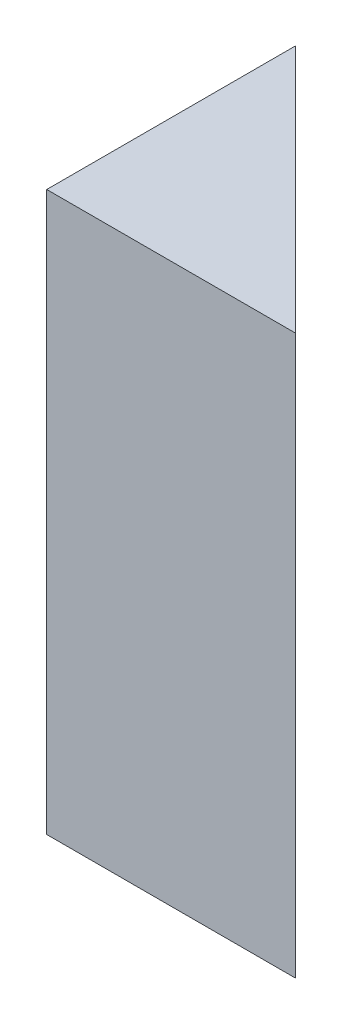
ISO-10303-21;
HEADER;
FILE_DESCRIPTION(('STEP AP214'),'2;1');
FILE_NAME('part.step','',(''),(''),'','','');
FILE_SCHEMA(('AUTOMOTIVE_DESIGN { 1 0 10303 214 1 1 1 1 }'));
ENDSEC;
DATA;
#1=APPLICATION_CONTEXT('core data for automotive mechanical design processes');
#2=APPLICATION_PROTOCOL_DEFINITION('international standard','automotive_design',2000,#1);
#3=PRODUCT_CONTEXT('',#1,'mechanical');
#4=PRODUCT('Part','Part','',(#3));
#5=PRODUCT_RELATED_PRODUCT_CATEGORY('part','',(#4));
#6=PRODUCT_DEFINITION_FORMATION('','',#4);
#7=PRODUCT_DEFINITION_CONTEXT('part definition',#1,'design');
#8=PRODUCT_DEFINITION('design','',#6,#7);
#9=PRODUCT_DEFINITION_SHAPE('','',#8);
#10=(LENGTH_UNIT() NAMED_UNIT(*) SI_UNIT(.MILLI.,.METRE.));
#11=(NAMED_UNIT(*) PLANE_ANGLE_UNIT() SI_UNIT($,.RADIAN.));
#12=(NAMED_UNIT(*) SI_UNIT($,.STERADIAN.) SOLID_ANGLE_UNIT());
#13=UNCERTAINTY_MEASURE_WITH_UNIT(LENGTH_MEASURE(1.E-05),#10,'distance_accuracy_value','');
#14=(GEOMETRIC_REPRESENTATION_CONTEXT(3) GLOBAL_UNCERTAINTY_ASSIGNED_CONTEXT((#13)) GLOBAL_UNIT_ASSIGNED_CONTEXT((#10,
#11,#12)) REPRESENTATION_CONTEXT('',''));
#15=CARTESIAN_POINT('',(0.,0.,0.));
#16=DIRECTION('',(0.,0.,1.));
#17=DIRECTION('',(1.,0.,0.));
#18=AXIS2_PLACEMENT_3D('',#15,#16,#17);
#19=CARTESIAN_POINT('',(0.,44.958,-20.));
#20=DIRECTION('',(1.,0.,0.));
#21=DIRECTION('',(0.,0.,-1.));
#22=AXIS2_PLACEMENT_3D('',#19,#20,#21);
#23=PLANE('',#22);
#24=DIRECTION('',(0.,0.,1.));
#25=VECTOR('',#24,1.);
#26=CARTESIAN_POINT('',(0.,0.,-20.));
#27=LINE('',#26,#25);
#28=CARTESIAN_POINT('',(0.,0.,-20.));
#29=VERTEX_POINT('',#28);
#30=CARTESIAN_POINT('',(0.,0.,0.));
#31=VERTEX_POINT('',#30);
#32=EDGE_CURVE('E80',#29,#31,#27,.T.);
#33=ORIENTED_EDGE('',*,*,#32,.T.);
#34=DIRECTION('',(0.,-1.,0.));
#35=VECTOR('',#34,1.);
#36=CARTESIAN_POINT('',(0.,44.958,0.));
#37=LINE('',#36,#35);
#38=CARTESIAN_POINT('',(0.,44.958,0.));
#39=VERTEX_POINT('',#38);
#40=EDGE_CURVE('E11',#39,#31,#37,.T.);
#41=ORIENTED_EDGE('',*,*,#40,.F.);
#42=DIRECTION('',(0.,0.,1.));
#43=VECTOR('',#42,1.);
#44=CARTESIAN_POINT('',(0.,44.958,-20.));
#45=LINE('',#44,#43);
#46=CARTESIAN_POINT('',(0.,44.958,-20.));
#47=VERTEX_POINT('',#46);
#48=EDGE_CURVE('E73',#47,#39,#45,.T.);
#49=ORIENTED_EDGE('',*,*,#48,.F.);
#50=DIRECTION('',(0.,-1.,0.));
#51=VECTOR('',#50,1.);
#52=CARTESIAN_POINT('',(0.,44.958,-20.));
#53=LINE('',#52,#51);
#54=EDGE_CURVE('E81',#47,#29,#53,.T.);
#55=ORIENTED_EDGE('',*,*,#54,.T.);
#56=EDGE_LOOP('',(#33,#41,#49,#55));
#57=FACE_BOUND('',#56,.T.);
#58=ADVANCED_FACE('F33',(#57),#23,.F.);
#59=CARTESIAN_POINT('',(0.,44.958,0.));
#60=DIRECTION('',(0.,0.,-1.));
#61=DIRECTION('',(-1.,0.,0.));
#62=AXIS2_PLACEMENT_3D('',#59,#60,#61);
#63=PLANE('',#62);
#64=DIRECTION('',(1.,0.,0.));
#65=VECTOR('',#64,1.);
#66=CARTESIAN_POINT('',(0.,0.,0.));
#67=LINE('',#66,#65);
#68=CARTESIAN_POINT('',(20.,0.,0.));
#69=VERTEX_POINT('',#68);
#70=EDGE_CURVE('E61',#31,#69,#67,.T.);
#71=ORIENTED_EDGE('',*,*,#70,.T.);
#72=DIRECTION('',(0.,-1.,0.));
#73=VECTOR('',#72,1.);
#74=CARTESIAN_POINT('',(20.,44.958,0.));
#75=LINE('',#74,#73);
#76=CARTESIAN_POINT('',(20.,44.958,0.));
#77=VERTEX_POINT('',#76);
#78=EDGE_CURVE('E41',#77,#69,#75,.T.);
#79=ORIENTED_EDGE('',*,*,#78,.F.);
#80=DIRECTION('',(1.,0.,0.));
#81=VECTOR('',#80,1.);
#82=CARTESIAN_POINT('',(0.,44.958,0.));
#83=LINE('',#82,#81);
#84=EDGE_CURVE('E69',#39,#77,#83,.T.);
#85=ORIENTED_EDGE('',*,*,#84,.F.);
#86=ORIENTED_EDGE('',*,*,#40,.T.);
#87=EDGE_LOOP('',(#71,#79,#85,#86));
#88=FACE_BOUND('',#87,.T.);
#89=ADVANCED_FACE('F70',(#88),#63,.F.);
#90=CARTESIAN_POINT('',(20.,44.958,0.));
#91=DIRECTION('',(-0.707106781186548,0.,0.707106781186548));
#92=DIRECTION('',(0.707106781186548,0.,0.707106781186548));
#93=AXIS2_PLACEMENT_3D('',#90,#91,#92);
#94=PLANE('',#93);
#95=DIRECTION('',(-0.707106781186548,0.,-0.707106781186548));
#96=VECTOR('',#95,1.);
#97=CARTESIAN_POINT('',(20.,0.,0.));
#98=LINE('',#97,#96);
#99=EDGE_CURVE('E66',#69,#29,#98,.T.);
#100=ORIENTED_EDGE('',*,*,#99,.T.);
#101=ORIENTED_EDGE('',*,*,#54,.F.);
#102=DIRECTION('',(-0.707106781186548,0.,-0.707106781186548));
#103=VECTOR('',#102,1.);
#104=CARTESIAN_POINT('',(20.,44.958,0.));
#105=LINE('',#104,#103);
#106=EDGE_CURVE('E49',#77,#47,#105,.T.);
#107=ORIENTED_EDGE('',*,*,#106,.F.);
#108=ORIENTED_EDGE('',*,*,#78,.T.);
#109=EDGE_LOOP('',(#100,#101,#107,#108));
#110=FACE_BOUND('',#109,.T.);
#111=ADVANCED_FACE('F88',(#110),#94,.F.);
#112=CARTESIAN_POINT('',(0.,44.958,0.));
#113=DIRECTION('',(0.,1.,0.));
#114=DIRECTION('',(0.,0.,1.));
#115=AXIS2_PLACEMENT_3D('',#112,#113,#114);
#116=PLANE('',#115);
#117=ORIENTED_EDGE('',*,*,#48,.T.);
#118=ORIENTED_EDGE('',*,*,#84,.T.);
#119=ORIENTED_EDGE('',*,*,#106,.T.);
#120=EDGE_LOOP('',(#117,#118,#119));
#121=FACE_BOUND('',#120,.T.);
#122=ADVANCED_FACE('F76',(#121),#116,.T.);
#123=CARTESIAN_POINT('',(0.,0.,0.));
#124=DIRECTION('',(0.,1.,0.));
#125=DIRECTION('',(0.,0.,1.));
#126=AXIS2_PLACEMENT_3D('',#123,#124,#125);
#127=PLANE('',#126);
#128=ORIENTED_EDGE('',*,*,#32,.F.);
#129=ORIENTED_EDGE('',*,*,#99,.F.);
#130=ORIENTED_EDGE('',*,*,#70,.F.);
#131=EDGE_LOOP('',(#128,#129,#130));
#132=FACE_BOUND('',#131,.T.);
#133=ADVANCED_FACE('F89',(#132),#127,.F.);
#134=CLOSED_SHELL('',(#58,#89,#111,#122,#133));
#135=MANIFOLD_SOLID_BREP('B2',#134);
#136=ADVANCED_BREP_SHAPE_REPRESENTATION('',(#18,#135),#14);
#137=SHAPE_DEFINITION_REPRESENTATION(#9,#136);
ENDSEC;
END-ISO-10303-21;
